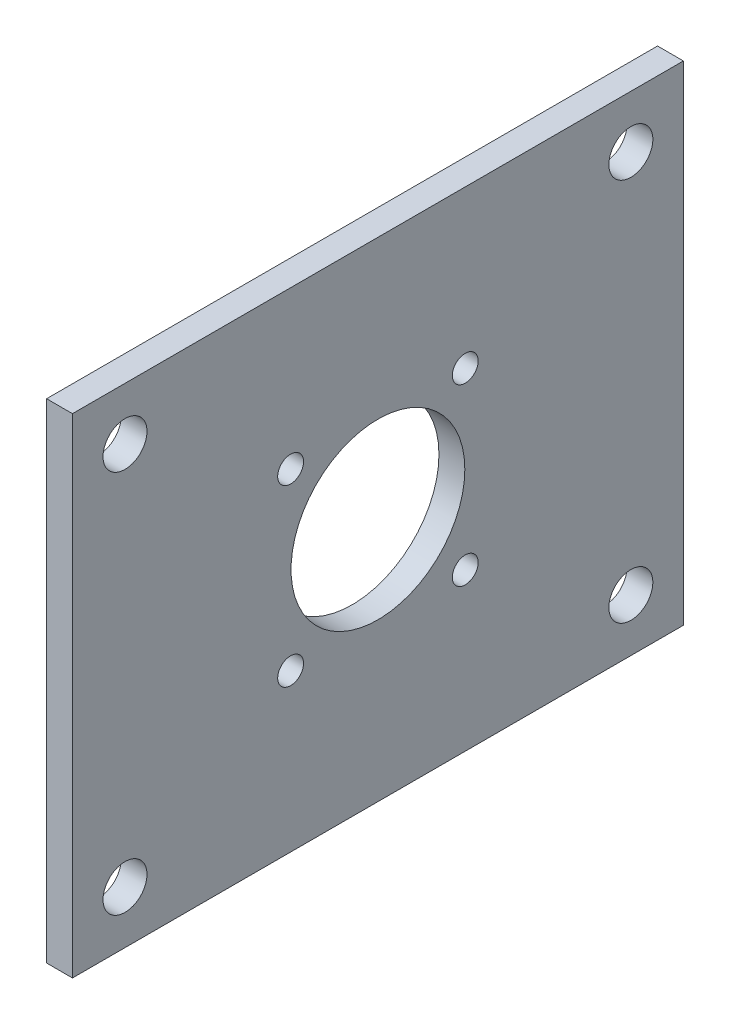
ISO-10303-21;
HEADER;
FILE_DESCRIPTION(('STEP AP214'),'2;1');
FILE_NAME('part.step','',(''),(''),'','','');
FILE_SCHEMA(('AUTOMOTIVE_DESIGN { 1 0 10303 214 1 1 1 1 }'));
ENDSEC;
DATA;
#1=APPLICATION_CONTEXT('core data for automotive mechanical design processes');
#2=APPLICATION_PROTOCOL_DEFINITION('international standard','automotive_design',2000,#1);
#3=PRODUCT_CONTEXT('',#1,'mechanical');
#4=PRODUCT('Part','Part','',(#3));
#5=PRODUCT_RELATED_PRODUCT_CATEGORY('part','',(#4));
#6=PRODUCT_DEFINITION_FORMATION('','',#4);
#7=PRODUCT_DEFINITION_CONTEXT('part definition',#1,'design');
#8=PRODUCT_DEFINITION('design','',#6,#7);
#9=PRODUCT_DEFINITION_SHAPE('','',#8);
#10=(LENGTH_UNIT() NAMED_UNIT(*) SI_UNIT(.MILLI.,.METRE.));
#11=(NAMED_UNIT(*) PLANE_ANGLE_UNIT() SI_UNIT($,.RADIAN.));
#12=(NAMED_UNIT(*) SI_UNIT($,.STERADIAN.) SOLID_ANGLE_UNIT());
#13=UNCERTAINTY_MEASURE_WITH_UNIT(LENGTH_MEASURE(1.E-05),#10,'distance_accuracy_value','');
#14=(GEOMETRIC_REPRESENTATION_CONTEXT(3) GLOBAL_UNCERTAINTY_ASSIGNED_CONTEXT((#13)) GLOBAL_UNIT_ASSIGNED_CONTEXT((#10,
#11,#12)) REPRESENTATION_CONTEXT('',''));
#15=CARTESIAN_POINT('',(0.,0.,0.));
#16=DIRECTION('',(0.,0.,1.));
#17=DIRECTION('',(1.,0.,0.));
#18=AXIS2_PLACEMENT_3D('',#15,#16,#17);
#19=CARTESIAN_POINT('',(-1.5875,-30.,-37.5));
#20=DIRECTION('',(0.,0.,-1.));
#21=DIRECTION('',(-1.,0.,0.));
#22=AXIS2_PLACEMENT_3D('',#19,#20,#21);
#23=PLANE('',#22);
#24=DIRECTION('',(1.,0.,0.));
#25=VECTOR('',#24,1.);
#26=CARTESIAN_POINT('',(-1.5875,30.,-37.5));
#27=LINE('',#26,#25);
#28=CARTESIAN_POINT('',(-1.5875,30.,-37.5));
#29=VERTEX_POINT('',#28);
#30=CARTESIAN_POINT('',(1.5875,30.,-37.5));
#31=VERTEX_POINT('',#30);
#32=EDGE_CURVE('E36',#29,#31,#27,.T.);
#33=ORIENTED_EDGE('',*,*,#32,.T.);
#34=DIRECTION('',(0.,1.,0.));
#35=VECTOR('',#34,1.);
#36=CARTESIAN_POINT('',(1.5875,-30.,-37.5));
#37=LINE('',#36,#35);
#38=CARTESIAN_POINT('',(1.5875,-30.,-37.5));
#39=VERTEX_POINT('',#38);
#40=EDGE_CURVE('E73',#39,#31,#37,.T.);
#41=ORIENTED_EDGE('',*,*,#40,.F.);
#42=DIRECTION('',(1.,0.,0.));
#43=VECTOR('',#42,1.);
#44=CARTESIAN_POINT('',(-1.5875,-30.,-37.5));
#45=LINE('',#44,#43);
#46=CARTESIAN_POINT('',(-1.5875,-30.,-37.5));
#47=VERTEX_POINT('',#46);
#48=EDGE_CURVE('E11',#47,#39,#45,.T.);
#49=ORIENTED_EDGE('',*,*,#48,.F.);
#50=DIRECTION('',(0.,1.,0.));
#51=VECTOR('',#50,1.);
#52=CARTESIAN_POINT('',(-1.5875,-30.,-37.5));
#53=LINE('',#52,#51);
#54=EDGE_CURVE('E74',#47,#29,#53,.T.);
#55=ORIENTED_EDGE('',*,*,#54,.T.);
#56=EDGE_LOOP('',(#33,#41,#49,#55));
#57=FACE_BOUND('',#56,.T.);
#58=ADVANCED_FACE('F33',(#57),#23,.T.);
#59=CARTESIAN_POINT('',(-1.5875,-30.,37.5));
#60=DIRECTION('',(0.,-1.,0.));
#61=DIRECTION('',(0.,0.,-1.));
#62=AXIS2_PLACEMENT_3D('',#59,#60,#61);
#63=PLANE('',#62);
#64=ORIENTED_EDGE('',*,*,#48,.T.);
#65=DIRECTION('',(0.,0.,-1.));
#66=VECTOR('',#65,1.);
#67=CARTESIAN_POINT('',(1.5875,-30.,37.5));
#68=LINE('',#67,#66);
#69=CARTESIAN_POINT('',(1.5875,-30.,37.5));
#70=VERTEX_POINT('',#69);
#71=EDGE_CURVE('E90',#70,#39,#68,.T.);
#72=ORIENTED_EDGE('',*,*,#71,.F.);
#73=DIRECTION('',(1.,0.,0.));
#74=VECTOR('',#73,1.);
#75=CARTESIAN_POINT('',(-1.5875,-30.,37.5));
#76=LINE('',#75,#74);
#77=CARTESIAN_POINT('',(-1.5875,-30.,37.5));
#78=VERTEX_POINT('',#77);
#79=EDGE_CURVE('E41',#78,#70,#76,.T.);
#80=ORIENTED_EDGE('',*,*,#79,.F.);
#81=DIRECTION('',(0.,0.,-1.));
#82=VECTOR('',#81,1.);
#83=CARTESIAN_POINT('',(-1.5875,-30.,37.5));
#84=LINE('',#83,#82);
#85=EDGE_CURVE('E79',#78,#47,#84,.T.);
#86=ORIENTED_EDGE('',*,*,#85,.T.);
#87=EDGE_LOOP('',(#64,#72,#80,#86));
#88=FACE_BOUND('',#87,.T.);
#89=ADVANCED_FACE('F110',(#88),#63,.T.);
#90=CARTESIAN_POINT('',(-1.5875,-30.,37.5));
#91=DIRECTION('',(0.,0.,1.));
#92=DIRECTION('',(1.,0.,0.));
#93=AXIS2_PLACEMENT_3D('',#90,#91,#92);
#94=PLANE('',#93);
#95=ORIENTED_EDGE('',*,*,#79,.T.);
#96=DIRECTION('',(0.,-1.,0.));
#97=VECTOR('',#96,1.);
#98=CARTESIAN_POINT('',(1.5875,-30.,37.5));
#99=LINE('',#98,#97);
#100=CARTESIAN_POINT('',(1.5875,30.,37.5));
#101=VERTEX_POINT('',#100);
#102=EDGE_CURVE('E86',#101,#70,#99,.T.);
#103=ORIENTED_EDGE('',*,*,#102,.F.);
#104=DIRECTION('',(1.,0.,0.));
#105=VECTOR('',#104,1.);
#106=CARTESIAN_POINT('',(-1.5875,30.,37.5));
#107=LINE('',#106,#105);
#108=CARTESIAN_POINT('',(-1.5875,30.,37.5));
#109=VERTEX_POINT('',#108);
#110=EDGE_CURVE('E78',#109,#101,#107,.T.);
#111=ORIENTED_EDGE('',*,*,#110,.F.);
#112=DIRECTION('',(0.,-1.,0.));
#113=VECTOR('',#112,1.);
#114=CARTESIAN_POINT('',(-1.5875,-30.,37.5));
#115=LINE('',#114,#113);
#116=EDGE_CURVE('E103',#109,#78,#115,.T.);
#117=ORIENTED_EDGE('',*,*,#116,.T.);
#118=EDGE_LOOP('',(#95,#103,#111,#117));
#119=FACE_BOUND('',#118,.T.);
#120=ADVANCED_FACE('F107',(#119),#94,.T.);
#121=CARTESIAN_POINT('',(-1.5875,30.,37.5));
#122=DIRECTION('',(0.,1.,0.));
#123=DIRECTION('',(0.,0.,1.));
#124=AXIS2_PLACEMENT_3D('',#121,#122,#123);
#125=PLANE('',#124);
#126=ORIENTED_EDGE('',*,*,#110,.T.);
#127=DIRECTION('',(0.,0.,1.));
#128=VECTOR('',#127,1.);
#129=CARTESIAN_POINT('',(1.5875,30.,37.5));
#130=LINE('',#129,#128);
#131=EDGE_CURVE('E81',#31,#101,#130,.T.);
#132=ORIENTED_EDGE('',*,*,#131,.F.);
#133=ORIENTED_EDGE('',*,*,#32,.F.);
#134=DIRECTION('',(0.,0.,1.));
#135=VECTOR('',#134,1.);
#136=CARTESIAN_POINT('',(-1.5875,30.,37.5));
#137=LINE('',#136,#135);
#138=EDGE_CURVE('E101',#29,#109,#137,.T.);
#139=ORIENTED_EDGE('',*,*,#138,.T.);
#140=EDGE_LOOP('',(#126,#132,#133,#139));
#141=FACE_BOUND('',#140,.T.);
#142=ADVANCED_FACE('F82',(#141),#125,.T.);
#143=CARTESIAN_POINT('',(-1.5875,0.,0.));
#144=DIRECTION('',(-1.,0.,0.));
#145=DIRECTION('',(0.,0.,1.));
#146=AXIS2_PLACEMENT_3D('',#143,#144,#145);
#147=PLANE('',#146);
#148=CARTESIAN_POINT('',(-1.5875,-10.7188,10.7188));
#149=DIRECTION('',(1.,0.,0.));
#150=DIRECTION('',(0.,0.,-1.));
#151=AXIS2_PLACEMENT_3D('',#148,#149,#150);
#152=CIRCLE('',#151,1.5875);
#153=CARTESIAN_POINT('',(-1.5875,-10.7188,9.1313));
#154=VERTEX_POINT('',#153);
#155=EDGE_CURVE('E245',#154,#154,#152,.T.);
#156=ORIENTED_EDGE('',*,*,#155,.T.);
#157=EDGE_LOOP('',(#156));
#158=FACE_BOUND('',#157,.T.);
#159=CARTESIAN_POINT('',(-1.5875,-10.7188,-10.7188));
#160=DIRECTION('',(1.,0.,0.));
#161=DIRECTION('',(0.,0.,-1.));
#162=AXIS2_PLACEMENT_3D('',#159,#160,#161);
#163=CIRCLE('',#162,1.5875);
#164=CARTESIAN_POINT('',(-1.5875,-10.7188,-12.3063));
#165=VERTEX_POINT('',#164);
#166=EDGE_CURVE('E253',#165,#165,#163,.T.);
#167=ORIENTED_EDGE('',*,*,#166,.T.);
#168=EDGE_LOOP('',(#167));
#169=FACE_BOUND('',#168,.T.);
#170=CARTESIAN_POINT('',(-1.5875,10.7188,-10.7188));
#171=DIRECTION('',(1.,0.,0.));
#172=DIRECTION('',(0.,0.,-1.));
#173=AXIS2_PLACEMENT_3D('',#170,#171,#172);
#174=CIRCLE('',#173,1.5875);
#175=CARTESIAN_POINT('',(-1.5875,10.7188,-12.3063));
#176=VERTEX_POINT('',#175);
#177=EDGE_CURVE('E312',#176,#176,#174,.T.);
#178=ORIENTED_EDGE('',*,*,#177,.T.);
#179=EDGE_LOOP('',(#178));
#180=FACE_BOUND('',#179,.T.);
#181=CARTESIAN_POINT('',(-1.5875,10.7188,10.7188));
#182=DIRECTION('',(1.,0.,0.));
#183=DIRECTION('',(0.,0.,-1.));
#184=AXIS2_PLACEMENT_3D('',#181,#182,#183);
#185=CIRCLE('',#184,1.5875);
#186=CARTESIAN_POINT('',(-1.5875,10.7188,9.1313));
#187=VERTEX_POINT('',#186);
#188=EDGE_CURVE('E260',#187,#187,#185,.T.);
#189=ORIENTED_EDGE('',*,*,#188,.T.);
#190=EDGE_LOOP('',(#189));
#191=FACE_BOUND('',#190,.T.);
#192=CARTESIAN_POINT('',(-1.5875,0.,0.));
#193=DIRECTION('',(1.,0.,0.));
#194=DIRECTION('',(0.,0.,-1.));
#195=AXIS2_PLACEMENT_3D('',#192,#193,#194);
#196=CIRCLE('',#195,10.668);
#197=CARTESIAN_POINT('',(-1.5875,0.,-10.668));
#198=VERTEX_POINT('',#197);
#199=EDGE_CURVE('E259',#198,#198,#196,.T.);
#200=ORIENTED_EDGE('',*,*,#199,.T.);
#201=EDGE_LOOP('',(#200));
#202=FACE_BOUND('',#201,.T.);
#203=CARTESIAN_POINT('',(-1.5875,-23.55,31.05));
#204=DIRECTION('',(1.,0.,0.));
#205=DIRECTION('',(0.,0.,1.));
#206=AXIS2_PLACEMENT_3D('',#203,#204,#205);
#207=CIRCLE('',#206,2.7);
#208=CARTESIAN_POINT('',(-1.5875,-23.55,33.75));
#209=VERTEX_POINT('',#208);
#210=EDGE_CURVE('E274',#209,#209,#207,.T.);
#211=ORIENTED_EDGE('',*,*,#210,.T.);
#212=EDGE_LOOP('',(#211));
#213=FACE_BOUND('',#212,.T.);
#214=CARTESIAN_POINT('',(-1.5875,-23.55,-31.05));
#215=DIRECTION('',(1.,0.,0.));
#216=DIRECTION('',(0.,0.,-1.));
#217=AXIS2_PLACEMENT_3D('',#214,#215,#216);
#218=CIRCLE('',#217,2.7);
#219=CARTESIAN_POINT('',(-1.5875,-23.55,-33.75));
#220=VERTEX_POINT('',#219);
#221=EDGE_CURVE('E268',#220,#220,#218,.T.);
#222=ORIENTED_EDGE('',*,*,#221,.T.);
#223=EDGE_LOOP('',(#222));
#224=FACE_BOUND('',#223,.T.);
#225=CARTESIAN_POINT('',(-1.5875,23.55,-31.05));
#226=DIRECTION('',(1.,0.,0.));
#227=DIRECTION('',(0.,0.,1.));
#228=AXIS2_PLACEMENT_3D('',#225,#226,#227);
#229=CIRCLE('',#228,2.7);
#230=CARTESIAN_POINT('',(-1.5875,23.55,-28.35));
#231=VERTEX_POINT('',#230);
#232=EDGE_CURVE('E267',#231,#231,#229,.T.);
#233=ORIENTED_EDGE('',*,*,#232,.T.);
#234=EDGE_LOOP('',(#233));
#235=FACE_BOUND('',#234,.T.);
#236=CARTESIAN_POINT('',(-1.5875,23.55,31.05));
#237=DIRECTION('',(1.,0.,0.));
#238=DIRECTION('',(0.,0.,-1.));
#239=AXIS2_PLACEMENT_3D('',#236,#237,#238);
#240=CIRCLE('',#239,2.7);
#241=CARTESIAN_POINT('',(-1.5875,23.55,28.35));
#242=VERTEX_POINT('',#241);
#243=EDGE_CURVE('E91',#242,#242,#240,.T.);
#244=ORIENTED_EDGE('',*,*,#243,.T.);
#245=EDGE_LOOP('',(#244));
#246=FACE_BOUND('',#245,.T.);
#247=ORIENTED_EDGE('',*,*,#54,.F.);
#248=ORIENTED_EDGE('',*,*,#85,.F.);
#249=ORIENTED_EDGE('',*,*,#116,.F.);
#250=ORIENTED_EDGE('',*,*,#138,.F.);
#251=EDGE_LOOP('',(#247,#248,#249,#250));
#252=FACE_BOUND('',#251,.T.);
#253=ADVANCED_FACE('F112',(#158,#169,#180,#191,#202,#213,#224,#235,#246,#252),#147,.T.);
#254=CARTESIAN_POINT('',(1.5875,0.,0.));
#255=DIRECTION('',(-1.,0.,0.));
#256=DIRECTION('',(0.,0.,1.));
#257=AXIS2_PLACEMENT_3D('',#254,#255,#256);
#258=PLANE('',#257);
#259=CARTESIAN_POINT('',(1.5875,-10.7188,10.7188));
#260=DIRECTION('',(1.,0.,0.));
#261=DIRECTION('',(0.,0.,-1.));
#262=AXIS2_PLACEMENT_3D('',#259,#260,#261);
#263=CIRCLE('',#262,1.5875);
#264=CARTESIAN_POINT('',(1.5875,-10.7188,9.1313));
#265=VERTEX_POINT('',#264);
#266=EDGE_CURVE('E248',#265,#265,#263,.T.);
#267=ORIENTED_EDGE('',*,*,#266,.F.);
#268=EDGE_LOOP('',(#267));
#269=FACE_BOUND('',#268,.T.);
#270=CARTESIAN_POINT('',(1.5875,-10.7188,-10.7188));
#271=DIRECTION('',(1.,0.,0.));
#272=DIRECTION('',(0.,0.,-1.));
#273=AXIS2_PLACEMENT_3D('',#270,#271,#272);
#274=CIRCLE('',#273,1.5875);
#275=CARTESIAN_POINT('',(1.5875,-10.7188,-12.3063));
#276=VERTEX_POINT('',#275);
#277=EDGE_CURVE('E250',#276,#276,#274,.T.);
#278=ORIENTED_EDGE('',*,*,#277,.F.);
#279=EDGE_LOOP('',(#278));
#280=FACE_BOUND('',#279,.T.);
#281=CARTESIAN_POINT('',(1.5875,10.7188,-10.7188));
#282=DIRECTION('',(1.,0.,0.));
#283=DIRECTION('',(0.,0.,-1.));
#284=AXIS2_PLACEMENT_3D('',#281,#282,#283);
#285=CIRCLE('',#284,1.5875);
#286=CARTESIAN_POINT('',(1.5875,10.7188,-12.3063));
#287=VERTEX_POINT('',#286);
#288=EDGE_CURVE('E315',#287,#287,#285,.T.);
#289=ORIENTED_EDGE('',*,*,#288,.F.);
#290=EDGE_LOOP('',(#289));
#291=FACE_BOUND('',#290,.T.);
#292=CARTESIAN_POINT('',(1.5875,10.7188,10.7188));
#293=DIRECTION('',(1.,0.,0.));
#294=DIRECTION('',(0.,0.,-1.));
#295=AXIS2_PLACEMENT_3D('',#292,#293,#294);
#296=CIRCLE('',#295,1.5875);
#297=CARTESIAN_POINT('',(1.5875,10.7188,9.1313));
#298=VERTEX_POINT('',#297);
#299=EDGE_CURVE('E307',#298,#298,#296,.T.);
#300=ORIENTED_EDGE('',*,*,#299,.F.);
#301=EDGE_LOOP('',(#300));
#302=FACE_BOUND('',#301,.T.);
#303=CARTESIAN_POINT('',(1.5875,0.,0.));
#304=DIRECTION('',(1.,0.,0.));
#305=DIRECTION('',(0.,0.,-1.));
#306=AXIS2_PLACEMENT_3D('',#303,#304,#305);
#307=CIRCLE('',#306,10.668);
#308=CARTESIAN_POINT('',(1.5875,0.,-10.668));
#309=VERTEX_POINT('',#308);
#310=EDGE_CURVE('E256',#309,#309,#307,.T.);
#311=ORIENTED_EDGE('',*,*,#310,.F.);
#312=EDGE_LOOP('',(#311));
#313=FACE_BOUND('',#312,.T.);
#314=CARTESIAN_POINT('',(1.5875,-23.55,31.05));
#315=DIRECTION('',(1.,0.,0.));
#316=DIRECTION('',(0.,0.,1.));
#317=AXIS2_PLACEMENT_3D('',#314,#315,#316);
#318=CIRCLE('',#317,2.7);
#319=CARTESIAN_POINT('',(1.5875,-23.55,33.75));
#320=VERTEX_POINT('',#319);
#321=EDGE_CURVE('E263',#320,#320,#318,.T.);
#322=ORIENTED_EDGE('',*,*,#321,.F.);
#323=EDGE_LOOP('',(#322));
#324=FACE_BOUND('',#323,.T.);
#325=CARTESIAN_POINT('',(1.5875,-23.55,-31.05));
#326=DIRECTION('',(1.,0.,0.));
#327=DIRECTION('',(0.,0.,-1.));
#328=AXIS2_PLACEMENT_3D('',#325,#326,#327);
#329=CIRCLE('',#328,2.7);
#330=CARTESIAN_POINT('',(1.5875,-23.55,-33.75));
#331=VERTEX_POINT('',#330);
#332=EDGE_CURVE('E271',#331,#331,#329,.T.);
#333=ORIENTED_EDGE('',*,*,#332,.F.);
#334=EDGE_LOOP('',(#333));
#335=FACE_BOUND('',#334,.T.);
#336=CARTESIAN_POINT('',(1.5875,23.55,-31.05));
#337=DIRECTION('',(1.,0.,0.));
#338=DIRECTION('',(0.,0.,1.));
#339=AXIS2_PLACEMENT_3D('',#336,#337,#338);
#340=CIRCLE('',#339,2.7);
#341=CARTESIAN_POINT('',(1.5875,23.55,-28.35));
#342=VERTEX_POINT('',#341);
#343=EDGE_CURVE('E264',#342,#342,#340,.T.);
#344=ORIENTED_EDGE('',*,*,#343,.F.);
#345=EDGE_LOOP('',(#344));
#346=FACE_BOUND('',#345,.T.);
#347=CARTESIAN_POINT('',(1.5875,23.55,31.05));
#348=DIRECTION('',(1.,0.,0.));
#349=DIRECTION('',(0.,0.,-1.));
#350=AXIS2_PLACEMENT_3D('',#347,#348,#349);
#351=CIRCLE('',#350,2.7);
#352=CARTESIAN_POINT('',(1.5875,23.55,28.35));
#353=VERTEX_POINT('',#352);
#354=EDGE_CURVE('E94',#353,#353,#351,.T.);
#355=ORIENTED_EDGE('',*,*,#354,.F.);
#356=EDGE_LOOP('',(#355));
#357=FACE_BOUND('',#356,.T.);
#358=ORIENTED_EDGE('',*,*,#40,.T.);
#359=ORIENTED_EDGE('',*,*,#131,.T.);
#360=ORIENTED_EDGE('',*,*,#102,.T.);
#361=ORIENTED_EDGE('',*,*,#71,.T.);
#362=EDGE_LOOP('',(#358,#359,#360,#361));
#363=FACE_BOUND('',#362,.T.);
#364=ADVANCED_FACE('F89',(#269,#280,#291,#302,#313,#324,#335,#346,#357,#363),#258,.F.);
#365=CARTESIAN_POINT('',(-1.5875,23.55,31.05));
#366=DIRECTION('',(1.,0.,0.));
#367=DIRECTION('',(0.,0.,-1.));
#368=AXIS2_PLACEMENT_3D('',#365,#366,#367);
#369=CYLINDRICAL_SURFACE('',#368,2.7);
#370=ORIENTED_EDGE('',*,*,#243,.F.);
#371=EDGE_LOOP('',(#370));
#372=FACE_BOUND('',#371,.T.);
#373=ORIENTED_EDGE('',*,*,#354,.T.);
#374=EDGE_LOOP('',(#373));
#375=FACE_BOUND('',#374,.T.);
#376=ADVANCED_FACE('F120',(#372,#375),#369,.F.);
#377=CARTESIAN_POINT('',(-1.5875,23.55,-31.05));
#378=DIRECTION('',(1.,0.,0.));
#379=DIRECTION('',(0.,0.,-1.));
#380=AXIS2_PLACEMENT_3D('',#377,#378,#379);
#381=CYLINDRICAL_SURFACE('',#380,2.7);
#382=ORIENTED_EDGE('',*,*,#232,.F.);
#383=EDGE_LOOP('',(#382));
#384=FACE_BOUND('',#383,.T.);
#385=ORIENTED_EDGE('',*,*,#343,.T.);
#386=EDGE_LOOP('',(#385));
#387=FACE_BOUND('',#386,.T.);
#388=ADVANCED_FACE('F150',(#384,#387),#381,.F.);
#389=CARTESIAN_POINT('',(-1.5875,-23.55,-31.05));
#390=DIRECTION('',(1.,0.,0.));
#391=DIRECTION('',(0.,0.,-1.));
#392=AXIS2_PLACEMENT_3D('',#389,#390,#391);
#393=CYLINDRICAL_SURFACE('',#392,2.7);
#394=ORIENTED_EDGE('',*,*,#221,.F.);
#395=EDGE_LOOP('',(#394));
#396=FACE_BOUND('',#395,.T.);
#397=ORIENTED_EDGE('',*,*,#332,.T.);
#398=EDGE_LOOP('',(#397));
#399=FACE_BOUND('',#398,.T.);
#400=ADVANCED_FACE('F161',(#396,#399),#393,.F.);
#401=CARTESIAN_POINT('',(-1.5875,-23.55,31.05));
#402=DIRECTION('',(1.,0.,0.));
#403=DIRECTION('',(0.,0.,-1.));
#404=AXIS2_PLACEMENT_3D('',#401,#402,#403);
#405=CYLINDRICAL_SURFACE('',#404,2.7);
#406=ORIENTED_EDGE('',*,*,#210,.F.);
#407=EDGE_LOOP('',(#406));
#408=FACE_BOUND('',#407,.T.);
#409=ORIENTED_EDGE('',*,*,#321,.T.);
#410=EDGE_LOOP('',(#409));
#411=FACE_BOUND('',#410,.T.);
#412=ADVANCED_FACE('F171',(#408,#411),#405,.F.);
#413=CARTESIAN_POINT('',(-1.5875,0.,0.));
#414=DIRECTION('',(1.,0.,0.));
#415=DIRECTION('',(0.,0.,-1.));
#416=AXIS2_PLACEMENT_3D('',#413,#414,#415);
#417=CYLINDRICAL_SURFACE('',#416,10.668);
#418=ORIENTED_EDGE('',*,*,#199,.F.);
#419=EDGE_LOOP('',(#418));
#420=FACE_BOUND('',#419,.T.);
#421=ORIENTED_EDGE('',*,*,#310,.T.);
#422=EDGE_LOOP('',(#421));
#423=FACE_BOUND('',#422,.T.);
#424=ADVANCED_FACE('F180',(#420,#423),#417,.F.);
#425=CARTESIAN_POINT('',(-1.5875,10.7188,10.7188));
#426=DIRECTION('',(1.,0.,0.));
#427=DIRECTION('',(0.,0.,-1.));
#428=AXIS2_PLACEMENT_3D('',#425,#426,#427);
#429=CYLINDRICAL_SURFACE('',#428,1.5875);
#430=ORIENTED_EDGE('',*,*,#188,.F.);
#431=EDGE_LOOP('',(#430));
#432=FACE_BOUND('',#431,.T.);
#433=ORIENTED_EDGE('',*,*,#299,.T.);
#434=EDGE_LOOP('',(#433));
#435=FACE_BOUND('',#434,.T.);
#436=ADVANCED_FACE('F199',(#432,#435),#429,.F.);
#437=CARTESIAN_POINT('',(-1.5875,10.7188,-10.7188));
#438=DIRECTION('',(1.,0.,0.));
#439=DIRECTION('',(0.,0.,-1.));
#440=AXIS2_PLACEMENT_3D('',#437,#438,#439);
#441=CYLINDRICAL_SURFACE('',#440,1.5875);
#442=ORIENTED_EDGE('',*,*,#177,.F.);
#443=EDGE_LOOP('',(#442));
#444=FACE_BOUND('',#443,.T.);
#445=ORIENTED_EDGE('',*,*,#288,.T.);
#446=EDGE_LOOP('',(#445));
#447=FACE_BOUND('',#446,.T.);
#448=ADVANCED_FACE('F209',(#444,#447),#441,.F.);
#449=CARTESIAN_POINT('',(-1.5875,-10.7188,-10.7188));
#450=DIRECTION('',(1.,0.,0.));
#451=DIRECTION('',(0.,0.,-1.));
#452=AXIS2_PLACEMENT_3D('',#449,#450,#451);
#453=CYLINDRICAL_SURFACE('',#452,1.5875);
#454=ORIENTED_EDGE('',*,*,#166,.F.);
#455=EDGE_LOOP('',(#454));
#456=FACE_BOUND('',#455,.T.);
#457=ORIENTED_EDGE('',*,*,#277,.T.);
#458=EDGE_LOOP('',(#457));
#459=FACE_BOUND('',#458,.T.);
#460=ADVANCED_FACE('F219',(#456,#459),#453,.F.);
#461=CARTESIAN_POINT('',(-1.5875,-10.7188,10.7188));
#462=DIRECTION('',(1.,0.,0.));
#463=DIRECTION('',(0.,0.,-1.));
#464=AXIS2_PLACEMENT_3D('',#461,#462,#463);
#465=CYLINDRICAL_SURFACE('',#464,1.5875);
#466=ORIENTED_EDGE('',*,*,#155,.F.);
#467=EDGE_LOOP('',(#466));
#468=FACE_BOUND('',#467,.T.);
#469=ORIENTED_EDGE('',*,*,#266,.T.);
#470=EDGE_LOOP('',(#469));
#471=FACE_BOUND('',#470,.T.);
#472=ADVANCED_FACE('F229',(#468,#471),#465,.F.);
#473=CLOSED_SHELL('',(#58,#89,#120,#142,#253,#364,#376,#388,#400,#412,#424,#436,#448,#460,#472));
#474=MANIFOLD_SOLID_BREP('B2',#473);
#475=ADVANCED_BREP_SHAPE_REPRESENTATION('',(#18,#474),#14);
#476=SHAPE_DEFINITION_REPRESENTATION(#9,#475);
ENDSEC;
END-ISO-10303-21;
